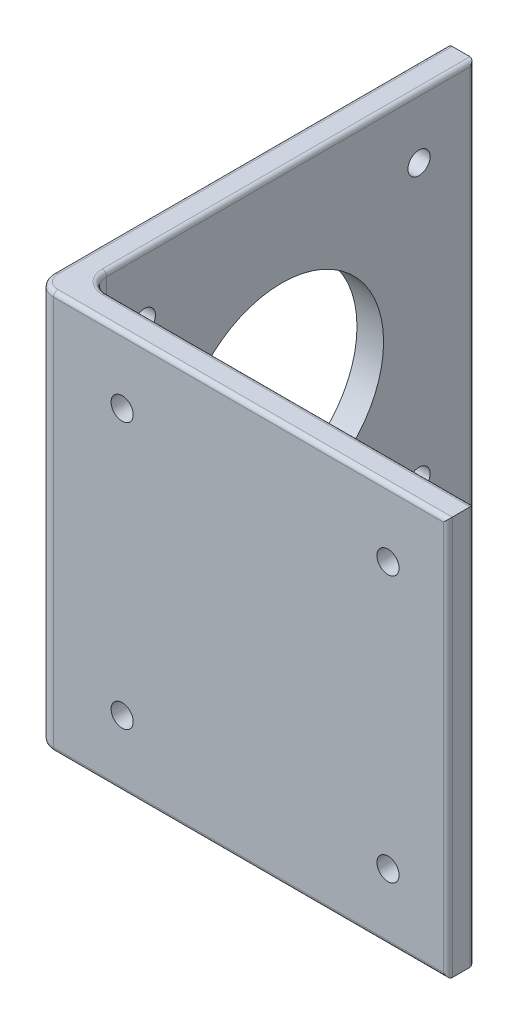
ISO-10303-21;
HEADER;
FILE_DESCRIPTION(('STEP AP214'),'2;1');
FILE_NAME('part.step','',(''),(''),'','','');
FILE_SCHEMA(('AUTOMOTIVE_DESIGN { 1 0 10303 214 1 1 1 1 }'));
ENDSEC;
DATA;
#1=APPLICATION_CONTEXT('core data for automotive mechanical design processes');
#2=APPLICATION_PROTOCOL_DEFINITION('international standard','automotive_design',2000,#1);
#3=PRODUCT_CONTEXT('',#1,'mechanical');
#4=PRODUCT('Part','Part','',(#3));
#5=PRODUCT_RELATED_PRODUCT_CATEGORY('part','',(#4));
#6=PRODUCT_DEFINITION_FORMATION('','',#4);
#7=PRODUCT_DEFINITION_CONTEXT('part definition',#1,'design');
#8=PRODUCT_DEFINITION('design','',#6,#7);
#9=PRODUCT_DEFINITION_SHAPE('','',#8);
#10=(LENGTH_UNIT() NAMED_UNIT(*) SI_UNIT(.MILLI.,.METRE.));
#11=(NAMED_UNIT(*) PLANE_ANGLE_UNIT() SI_UNIT($,.RADIAN.));
#12=(NAMED_UNIT(*) SI_UNIT($,.STERADIAN.) SOLID_ANGLE_UNIT());
#13=UNCERTAINTY_MEASURE_WITH_UNIT(LENGTH_MEASURE(1.E-05),#10,'distance_accuracy_value','');
#14=(GEOMETRIC_REPRESENTATION_CONTEXT(3) GLOBAL_UNCERTAINTY_ASSIGNED_CONTEXT((#13)) GLOBAL_UNIT_ASSIGNED_CONTEXT((#10,
#11,#12)) REPRESENTATION_CONTEXT('',''));
#15=CARTESIAN_POINT('',(0.,0.,0.));
#16=DIRECTION('',(0.,0.,1.));
#17=DIRECTION('',(1.,0.,0.));
#18=AXIS2_PLACEMENT_3D('',#15,#16,#17);
#19=CARTESIAN_POINT('',(-22.5,45.,24.));
#20=DIRECTION('',(0.,0.,-1.));
#21=DIRECTION('',(-1.,0.,0.));
#22=AXIS2_PLACEMENT_3D('',#19,#20,#21);
#23=PLANE('',#22);
#24=DIRECTION('',(0.,-1.,0.));
#25=VECTOR('',#24,1.);
#26=CARTESIAN_POINT('',(-22.,45.,24.));
#27=LINE('',#26,#25);
#28=CARTESIAN_POINT('',(-22.,44.5,24.));
#29=VERTEX_POINT('',#28);
#30=CARTESIAN_POINT('',(-22.,0.5,24.));
#31=VERTEX_POINT('',#30);
#32=EDGE_CURVE('E300',#29,#31,#27,.T.);
#33=ORIENTED_EDGE('',*,*,#32,.T.);
#34=DIRECTION('',(1.,0.,0.));
#35=VECTOR('',#34,1.);
#36=CARTESIAN_POINT('',(22.5,0.5,24.));
#37=LINE('',#36,#35);
#38=CARTESIAN_POINT('',(22.,0.5,24.));
#39=VERTEX_POINT('',#38);
#40=EDGE_CURVE('E255',#31,#39,#37,.T.);
#41=ORIENTED_EDGE('',*,*,#40,.T.);
#42=DIRECTION('',(0.,-1.,0.));
#43=VECTOR('',#42,1.);
#44=CARTESIAN_POINT('',(22.,45.,24.));
#45=LINE('',#44,#43);
#46=CARTESIAN_POINT('',(22.,44.5,24.));
#47=VERTEX_POINT('',#46);
#48=EDGE_CURVE('E259',#39,#47,#45,.F.);
#49=ORIENTED_EDGE('',*,*,#48,.T.);
#50=DIRECTION('',(1.,0.,0.));
#51=VECTOR('',#50,1.);
#52=CARTESIAN_POINT('',(-22.5,44.5,24.));
#53=LINE('',#52,#51);
#54=EDGE_CURVE('E257',#47,#29,#53,.F.);
#55=ORIENTED_EDGE('',*,*,#54,.T.);
#56=EDGE_LOOP('',(#33,#41,#49,#55));
#57=FACE_BOUND('',#56,.T.);
#58=CARTESIAN_POINT('',(-14.25,37.5,24.));
#59=DIRECTION('',(0.,0.,-1.));
#60=DIRECTION('',(-1.,0.,0.));
#61=AXIS2_PLACEMENT_3D('',#58,#59,#60);
#62=CIRCLE('',#61,1.24999999999999);
#63=CARTESIAN_POINT('',(-15.5,37.5,24.));
#64=VERTEX_POINT('',#63);
#65=EDGE_CURVE('E350',#64,#64,#62,.T.);
#66=ORIENTED_EDGE('',*,*,#65,.T.);
#67=EDGE_LOOP('',(#66));
#68=FACE_BOUND('',#67,.T.);
#69=CARTESIAN_POINT('',(-14.25,7.5,24.));
#70=DIRECTION('',(0.,0.,-1.));
#71=DIRECTION('',(-1.,0.,0.));
#72=AXIS2_PLACEMENT_3D('',#69,#70,#71);
#73=CIRCLE('',#72,1.24999999999999);
#74=CARTESIAN_POINT('',(-15.5,7.5,24.));
#75=VERTEX_POINT('',#74);
#76=EDGE_CURVE('E344',#75,#75,#73,.T.);
#77=ORIENTED_EDGE('',*,*,#76,.T.);
#78=EDGE_LOOP('',(#77));
#79=FACE_BOUND('',#78,.T.);
#80=CARTESIAN_POINT('',(15.75,7.5,24.));
#81=DIRECTION('',(0.,0.,-1.));
#82=DIRECTION('',(-1.,0.,0.));
#83=AXIS2_PLACEMENT_3D('',#80,#81,#82);
#84=CIRCLE('',#83,1.24999999999999);
#85=CARTESIAN_POINT('',(14.5,7.5,24.));
#86=VERTEX_POINT('',#85);
#87=EDGE_CURVE('E338',#86,#86,#84,.T.);
#88=ORIENTED_EDGE('',*,*,#87,.T.);
#89=EDGE_LOOP('',(#88));
#90=FACE_BOUND('',#89,.T.);
#91=CARTESIAN_POINT('',(15.75,37.5,24.));
#92=DIRECTION('',(0.,0.,-1.));
#93=DIRECTION('',(-1.,0.,0.));
#94=AXIS2_PLACEMENT_3D('',#91,#92,#93);
#95=CIRCLE('',#94,1.24999999999999);
#96=CARTESIAN_POINT('',(14.5,37.5,24.));
#97=VERTEX_POINT('',#96);
#98=EDGE_CURVE('E332',#97,#97,#95,.T.);
#99=ORIENTED_EDGE('',*,*,#98,.T.);
#100=EDGE_LOOP('',(#99));
#101=FACE_BOUND('',#100,.T.);
#102=ADVANCED_FACE('F39',(#57,#68,#79,#90,#101),#23,.F.);
#103=CARTESIAN_POINT('',(22.5,45.,21.));
#104=DIRECTION('',(1.,0.,0.));
#105=DIRECTION('',(0.,0.,-1.));
#106=AXIS2_PLACEMENT_3D('',#103,#104,#105);
#107=PLANE('',#106);
#108=DIRECTION('',(0.,0.,1.));
#109=VECTOR('',#108,1.);
#110=CARTESIAN_POINT('',(22.5,0.,21.));
#111=LINE('',#110,#109);
#112=CARTESIAN_POINT('',(22.5,0.,21.5));
#113=VERTEX_POINT('',#112);
#114=CARTESIAN_POINT('',(22.5,0.,23.5));
#115=VERTEX_POINT('',#114);
#116=EDGE_CURVE('E176',#113,#115,#111,.T.);
#117=ORIENTED_EDGE('',*,*,#116,.F.);
#118=DIRECTION('',(0.,-1.,0.));
#119=VECTOR('',#118,1.);
#120=CARTESIAN_POINT('',(22.5,45.,21.5));
#121=LINE('',#120,#119);
#122=CARTESIAN_POINT('',(22.5,45.,21.5));
#123=VERTEX_POINT('',#122);
#124=EDGE_CURVE('E11',#113,#123,#121,.F.);
#125=ORIENTED_EDGE('',*,*,#124,.T.);
#126=DIRECTION('',(0.,0.,1.));
#127=VECTOR('',#126,1.);
#128=CARTESIAN_POINT('',(22.5,45.,21.));
#129=LINE('',#128,#127);
#130=CARTESIAN_POINT('',(22.5,45.,23.5));
#131=VERTEX_POINT('',#130);
#132=EDGE_CURVE('E175',#123,#131,#129,.T.);
#133=ORIENTED_EDGE('',*,*,#132,.T.);
#134=DIRECTION('',(0.,-1.,0.));
#135=VECTOR('',#134,1.);
#136=CARTESIAN_POINT('',(22.5,0.,23.5));
#137=LINE('',#136,#135);
#138=EDGE_CURVE('E48',#131,#115,#137,.T.);
#139=ORIENTED_EDGE('',*,*,#138,.T.);
#140=EDGE_LOOP('',(#117,#125,#133,#139));
#141=FACE_BOUND('',#140,.T.);
#142=ADVANCED_FACE('F394',(#141),#107,.T.);
#143=CARTESIAN_POINT('',(-22.5,45.,21.));
#144=DIRECTION('',(0.,0.,-1.));
#145=DIRECTION('',(-1.,0.,0.));
#146=AXIS2_PLACEMENT_3D('',#143,#144,#145);
#147=PLANE('',#146);
#148=CARTESIAN_POINT('',(-14.25,37.5,21.));
#149=DIRECTION('',(0.,0.,-1.));
#150=DIRECTION('',(-1.,0.,0.));
#151=AXIS2_PLACEMENT_3D('',#148,#149,#150);
#152=CIRCLE('',#151,1.24999999999999);
#153=CARTESIAN_POINT('',(-15.5,37.5,21.));
#154=VERTEX_POINT('',#153);
#155=EDGE_CURVE('E209',#154,#154,#152,.T.);
#156=ORIENTED_EDGE('',*,*,#155,.F.);
#157=EDGE_LOOP('',(#156));
#158=FACE_BOUND('',#157,.T.);
#159=CARTESIAN_POINT('',(-14.25,7.5,21.));
#160=DIRECTION('',(0.,0.,-1.));
#161=DIRECTION('',(-1.,0.,0.));
#162=AXIS2_PLACEMENT_3D('',#159,#160,#161);
#163=CIRCLE('',#162,1.24999999999999);
#164=CARTESIAN_POINT('',(-15.5,7.5,21.));
#165=VERTEX_POINT('',#164);
#166=EDGE_CURVE('E347',#165,#165,#163,.T.);
#167=ORIENTED_EDGE('',*,*,#166,.F.);
#168=EDGE_LOOP('',(#167));
#169=FACE_BOUND('',#168,.T.);
#170=CARTESIAN_POINT('',(15.75,7.5,21.));
#171=DIRECTION('',(0.,0.,-1.));
#172=DIRECTION('',(-1.,0.,0.));
#173=AXIS2_PLACEMENT_3D('',#170,#171,#172);
#174=CIRCLE('',#173,1.24999999999999);
#175=CARTESIAN_POINT('',(14.5,7.5,21.));
#176=VERTEX_POINT('',#175);
#177=EDGE_CURVE('E341',#176,#176,#174,.T.);
#178=ORIENTED_EDGE('',*,*,#177,.F.);
#179=EDGE_LOOP('',(#178));
#180=FACE_BOUND('',#179,.T.);
#181=CARTESIAN_POINT('',(15.75,37.5,21.));
#182=DIRECTION('',(0.,0.,-1.));
#183=DIRECTION('',(-1.,0.,0.));
#184=AXIS2_PLACEMENT_3D('',#181,#182,#183);
#185=CIRCLE('',#184,1.24999999999999);
#186=CARTESIAN_POINT('',(14.5,37.5,21.));
#187=VERTEX_POINT('',#186);
#188=EDGE_CURVE('E335',#187,#187,#185,.T.);
#189=ORIENTED_EDGE('',*,*,#188,.F.);
#190=EDGE_LOOP('',(#189));
#191=FACE_BOUND('',#190,.T.);
#192=DIRECTION('',(0.,-1.,0.));
#193=VECTOR('',#192,1.);
#194=CARTESIAN_POINT('',(22.,45.,21.));
#195=LINE('',#194,#193);
#196=CARTESIAN_POINT('',(22.,44.5,21.));
#197=VERTEX_POINT('',#196);
#198=CARTESIAN_POINT('',(22.,0.5,21.));
#199=VERTEX_POINT('',#198);
#200=EDGE_CURVE('E253',#197,#199,#195,.T.);
#201=ORIENTED_EDGE('',*,*,#200,.T.);
#202=DIRECTION('',(1.,0.,0.));
#203=VECTOR('',#202,1.);
#204=CARTESIAN_POINT('',(-22.5,0.5,21.));
#205=LINE('',#204,#203);
#206=CARTESIAN_POINT('',(-19.,0.5,21.));
#207=VERTEX_POINT('',#206);
#208=EDGE_CURVE('E249',#199,#207,#205,.F.);
#209=ORIENTED_EDGE('',*,*,#208,.T.);
#210=DIRECTION('',(0.,-1.,0.));
#211=VECTOR('',#210,1.);
#212=CARTESIAN_POINT('',(-19.,45.,21.));
#213=LINE('',#212,#211);
#214=CARTESIAN_POINT('',(-19.,44.5,21.));
#215=VERTEX_POINT('',#214);
#216=EDGE_CURVE('E292',#207,#215,#213,.F.);
#217=ORIENTED_EDGE('',*,*,#216,.T.);
#218=DIRECTION('',(1.,0.,0.));
#219=VECTOR('',#218,1.);
#220=CARTESIAN_POINT('',(22.5,44.5,21.));
#221=LINE('',#220,#219);
#222=EDGE_CURVE('E251',#215,#197,#221,.T.);
#223=ORIENTED_EDGE('',*,*,#222,.T.);
#224=EDGE_LOOP('',(#201,#209,#217,#223));
#225=FACE_BOUND('',#224,.T.);
#226=ADVANCED_FACE('F367',(#158,#169,#180,#191,#225),#147,.T.);
#227=CARTESIAN_POINT('',(-21.,45.,-22.5));
#228=DIRECTION('',(1.,0.,0.));
#229=DIRECTION('',(0.,0.,-1.));
#230=AXIS2_PLACEMENT_3D('',#227,#228,#229);
#231=PLANE('',#230);
#232=CARTESIAN_POINT('',(-21.,22.5,-0.75));
#233=DIRECTION('',(1.,0.,0.));
#234=DIRECTION('',(0.,0.,-1.));
#235=AXIS2_PLACEMENT_3D('',#232,#233,#234);
#236=CIRCLE('',#235,11.5);
#237=CARTESIAN_POINT('',(-21.,22.5,-12.25));
#238=VERTEX_POINT('',#237);
#239=EDGE_CURVE('E357',#238,#238,#236,.T.);
#240=ORIENTED_EDGE('',*,*,#239,.F.);
#241=EDGE_LOOP('',(#240));
#242=FACE_BOUND('',#241,.T.);
#243=CARTESIAN_POINT('',(-21.,38.,14.75));
#244=DIRECTION('',(1.,0.,0.));
#245=DIRECTION('',(0.,0.,-1.));
#246=AXIS2_PLACEMENT_3D('',#243,#244,#245);
#247=CIRCLE('',#246,1.24999999999999);
#248=CARTESIAN_POINT('',(-21.,38.,13.5));
#249=VERTEX_POINT('',#248);
#250=EDGE_CURVE('E329',#249,#249,#247,.T.);
#251=ORIENTED_EDGE('',*,*,#250,.F.);
#252=EDGE_LOOP('',(#251));
#253=FACE_BOUND('',#252,.T.);
#254=CARTESIAN_POINT('',(-21.,38.,-16.25));
#255=DIRECTION('',(1.,0.,0.));
#256=DIRECTION('',(0.,0.,-1.));
#257=AXIS2_PLACEMENT_3D('',#254,#255,#256);
#258=CIRCLE('',#257,1.24999999999999);
#259=CARTESIAN_POINT('',(-21.,38.,-17.5));
#260=VERTEX_POINT('',#259);
#261=EDGE_CURVE('E323',#260,#260,#258,.T.);
#262=ORIENTED_EDGE('',*,*,#261,.F.);
#263=EDGE_LOOP('',(#262));
#264=FACE_BOUND('',#263,.T.);
#265=CARTESIAN_POINT('',(-21.,7.,-16.25));
#266=DIRECTION('',(1.,0.,0.));
#267=DIRECTION('',(0.,0.,-1.));
#268=AXIS2_PLACEMENT_3D('',#265,#266,#267);
#269=CIRCLE('',#268,1.24999999999999);
#270=CARTESIAN_POINT('',(-21.,7.,-17.5));
#271=VERTEX_POINT('',#270);
#272=EDGE_CURVE('E317',#271,#271,#269,.T.);
#273=ORIENTED_EDGE('',*,*,#272,.F.);
#274=EDGE_LOOP('',(#273));
#275=FACE_BOUND('',#274,.T.);
#276=CARTESIAN_POINT('',(-21.,7.,14.75));
#277=DIRECTION('',(1.,0.,0.));
#278=DIRECTION('',(0.,0.,-1.));
#279=AXIS2_PLACEMENT_3D('',#276,#277,#278);
#280=CIRCLE('',#279,1.24999999999999);
#281=CARTESIAN_POINT('',(-21.,7.,13.5));
#282=VERTEX_POINT('',#281);
#283=EDGE_CURVE('E311',#282,#282,#280,.T.);
#284=ORIENTED_EDGE('',*,*,#283,.F.);
#285=EDGE_LOOP('',(#284));
#286=FACE_BOUND('',#285,.T.);
#287=DIRECTION('',(0.,-1.,0.));
#288=VECTOR('',#287,1.);
#289=CARTESIAN_POINT('',(-21.,45.,-22.));
#290=LINE('',#289,#288);
#291=CARTESIAN_POINT('',(-21.,0.5,-22.));
#292=VERTEX_POINT('',#291);
#293=CARTESIAN_POINT('',(-21.,44.5,-22.));
#294=VERTEX_POINT('',#293);
#295=EDGE_CURVE('E56',#292,#294,#290,.F.);
#296=ORIENTED_EDGE('',*,*,#295,.T.);
#297=DIRECTION('',(0.,0.,1.));
#298=VECTOR('',#297,1.);
#299=CARTESIAN_POINT('',(-21.,44.5,19.));
#300=LINE('',#299,#298);
#301=CARTESIAN_POINT('',(-21.,44.5,19.));
#302=VERTEX_POINT('',#301);
#303=EDGE_CURVE('E240',#294,#302,#300,.T.);
#304=ORIENTED_EDGE('',*,*,#303,.T.);
#305=DIRECTION('',(0.,-1.,0.));
#306=VECTOR('',#305,1.);
#307=CARTESIAN_POINT('',(-21.,0.,19.));
#308=LINE('',#307,#306);
#309=CARTESIAN_POINT('',(-21.,0.5,19.));
#310=VERTEX_POINT('',#309);
#311=EDGE_CURVE('E295',#302,#310,#308,.T.);
#312=ORIENTED_EDGE('',*,*,#311,.T.);
#313=DIRECTION('',(0.,0.,1.));
#314=VECTOR('',#313,1.);
#315=CARTESIAN_POINT('',(-21.,0.5,-22.5));
#316=LINE('',#315,#314);
#317=EDGE_CURVE('E61',#310,#292,#316,.F.);
#318=ORIENTED_EDGE('',*,*,#317,.T.);
#319=EDGE_LOOP('',(#296,#304,#312,#318));
#320=FACE_BOUND('',#319,.T.);
#321=ADVANCED_FACE('F364',(#242,#253,#264,#275,#286,#320),#231,.T.);
#322=CARTESIAN_POINT('',(-24.,45.,-22.5));
#323=DIRECTION('',(0.,0.,-1.));
#324=DIRECTION('',(-1.,0.,0.));
#325=AXIS2_PLACEMENT_3D('',#322,#323,#324);
#326=PLANE('',#325);
#327=DIRECTION('',(1.,0.,0.));
#328=VECTOR('',#327,1.);
#329=CARTESIAN_POINT('',(-24.,0.,-22.5));
#330=LINE('',#329,#328);
#331=CARTESIAN_POINT('',(-23.5,0.,-22.5));
#332=VERTEX_POINT('',#331);
#333=CARTESIAN_POINT('',(-21.5,0.,-22.5));
#334=VERTEX_POINT('',#333);
#335=EDGE_CURVE('E158',#332,#334,#330,.T.);
#336=ORIENTED_EDGE('',*,*,#335,.F.);
#337=DIRECTION('',(0.,-1.,0.));
#338=VECTOR('',#337,1.);
#339=CARTESIAN_POINT('',(-23.5,45.,-22.5));
#340=LINE('',#339,#338);
#341=CARTESIAN_POINT('',(-23.5,45.,-22.5));
#342=VERTEX_POINT('',#341);
#343=EDGE_CURVE('E171',#332,#342,#340,.F.);
#344=ORIENTED_EDGE('',*,*,#343,.T.);
#345=DIRECTION('',(1.,0.,0.));
#346=VECTOR('',#345,1.);
#347=CARTESIAN_POINT('',(-24.,45.,-22.5));
#348=LINE('',#347,#346);
#349=CARTESIAN_POINT('',(-21.5,45.,-22.5));
#350=VERTEX_POINT('',#349);
#351=EDGE_CURVE('E302',#342,#350,#348,.T.);
#352=ORIENTED_EDGE('',*,*,#351,.T.);
#353=DIRECTION('',(0.,-1.,0.));
#354=VECTOR('',#353,1.);
#355=CARTESIAN_POINT('',(-21.5,45.,-22.5));
#356=LINE('',#355,#354);
#357=EDGE_CURVE('E174',#350,#334,#356,.T.);
#358=ORIENTED_EDGE('',*,*,#357,.T.);
#359=EDGE_LOOP('',(#336,#344,#352,#358));
#360=FACE_BOUND('',#359,.T.);
#361=ADVANCED_FACE('F169',(#360),#326,.T.);
#362=CARTESIAN_POINT('',(-24.,45.,-22.5));
#363=DIRECTION('',(1.,0.,0.));
#364=DIRECTION('',(0.,0.,-1.));
#365=AXIS2_PLACEMENT_3D('',#362,#363,#364);
#366=PLANE('',#365);
#367=CARTESIAN_POINT('',(-24.,22.5,-0.75));
#368=DIRECTION('',(1.,0.,0.));
#369=DIRECTION('',(0.,0.,-1.));
#370=AXIS2_PLACEMENT_3D('',#367,#368,#369);
#371=CIRCLE('',#370,11.5);
#372=CARTESIAN_POINT('',(-24.,22.5,-12.25));
#373=VERTEX_POINT('',#372);
#374=EDGE_CURVE('E213',#373,#373,#371,.F.);
#375=ORIENTED_EDGE('',*,*,#374,.F.);
#376=EDGE_LOOP('',(#375));
#377=FACE_BOUND('',#376,.T.);
#378=CARTESIAN_POINT('',(-24.,38.,14.75));
#379=DIRECTION('',(1.,0.,0.));
#380=DIRECTION('',(0.,0.,-1.));
#381=AXIS2_PLACEMENT_3D('',#378,#379,#380);
#382=CIRCLE('',#381,1.24999999999999);
#383=CARTESIAN_POINT('',(-24.,38.,13.5));
#384=VERTEX_POINT('',#383);
#385=EDGE_CURVE('E326',#384,#384,#382,.T.);
#386=ORIENTED_EDGE('',*,*,#385,.T.);
#387=EDGE_LOOP('',(#386));
#388=FACE_BOUND('',#387,.T.);
#389=CARTESIAN_POINT('',(-24.,38.,-16.25));
#390=DIRECTION('',(1.,0.,0.));
#391=DIRECTION('',(0.,0.,-1.));
#392=AXIS2_PLACEMENT_3D('',#389,#390,#391);
#393=CIRCLE('',#392,1.24999999999999);
#394=CARTESIAN_POINT('',(-24.,38.,-17.5));
#395=VERTEX_POINT('',#394);
#396=EDGE_CURVE('E320',#395,#395,#393,.T.);
#397=ORIENTED_EDGE('',*,*,#396,.T.);
#398=EDGE_LOOP('',(#397));
#399=FACE_BOUND('',#398,.T.);
#400=CARTESIAN_POINT('',(-24.,7.,-16.25));
#401=DIRECTION('',(1.,0.,0.));
#402=DIRECTION('',(0.,0.,-1.));
#403=AXIS2_PLACEMENT_3D('',#400,#401,#402);
#404=CIRCLE('',#403,1.24999999999999);
#405=CARTESIAN_POINT('',(-24.,7.,-17.5));
#406=VERTEX_POINT('',#405);
#407=EDGE_CURVE('E314',#406,#406,#404,.T.);
#408=ORIENTED_EDGE('',*,*,#407,.T.);
#409=EDGE_LOOP('',(#408));
#410=FACE_BOUND('',#409,.T.);
#411=CARTESIAN_POINT('',(-24.,7.,14.75));
#412=DIRECTION('',(1.,0.,0.));
#413=DIRECTION('',(0.,0.,-1.));
#414=AXIS2_PLACEMENT_3D('',#411,#412,#413);
#415=CIRCLE('',#414,1.24999999999999);
#416=CARTESIAN_POINT('',(-24.,7.,13.5));
#417=VERTEX_POINT('',#416);
#418=EDGE_CURVE('E305',#417,#417,#415,.T.);
#419=ORIENTED_EDGE('',*,*,#418,.T.);
#420=EDGE_LOOP('',(#419));
#421=FACE_BOUND('',#420,.T.);
#422=DIRECTION('',(0.,-1.,0.));
#423=VECTOR('',#422,1.);
#424=CARTESIAN_POINT('',(-24.,0.,-22.));
#425=LINE('',#424,#423);
#426=CARTESIAN_POINT('',(-24.,44.5,-22.));
#427=VERTEX_POINT('',#426);
#428=CARTESIAN_POINT('',(-24.,0.5,-22.));
#429=VERTEX_POINT('',#428);
#430=EDGE_CURVE('E247',#427,#429,#425,.T.);
#431=ORIENTED_EDGE('',*,*,#430,.T.);
#432=DIRECTION('',(0.,0.,1.));
#433=VECTOR('',#432,1.);
#434=CARTESIAN_POINT('',(-24.,0.5,22.));
#435=LINE('',#434,#433);
#436=CARTESIAN_POINT('',(-24.,0.5,22.));
#437=VERTEX_POINT('',#436);
#438=EDGE_CURVE('E189',#429,#437,#435,.T.);
#439=ORIENTED_EDGE('',*,*,#438,.T.);
#440=DIRECTION('',(0.,-1.,0.));
#441=VECTOR('',#440,1.);
#442=CARTESIAN_POINT('',(-24.,45.,22.));
#443=LINE('',#442,#441);
#444=CARTESIAN_POINT('',(-24.,44.5,22.));
#445=VERTEX_POINT('',#444);
#446=EDGE_CURVE('E297',#437,#445,#443,.F.);
#447=ORIENTED_EDGE('',*,*,#446,.T.);
#448=DIRECTION('',(0.,0.,1.));
#449=VECTOR('',#448,1.);
#450=CARTESIAN_POINT('',(-24.,44.5,-22.5));
#451=LINE('',#450,#449);
#452=EDGE_CURVE('E245',#445,#427,#451,.F.);
#453=ORIENTED_EDGE('',*,*,#452,.T.);
#454=EDGE_LOOP('',(#431,#439,#447,#453));
#455=FACE_BOUND('',#454,.T.);
#456=ADVANCED_FACE('F509',(#377,#388,#399,#410,#421,#455),#366,.F.);
#457=CARTESIAN_POINT('',(0.,45.,0.));
#458=DIRECTION('',(0.,-1.,0.));
#459=DIRECTION('',(-1.,0.,0.));
#460=AXIS2_PLACEMENT_3D('',#457,#458,#459);
#461=PLANE('',#460);
#462=ORIENTED_EDGE('',*,*,#132,.F.);
#463=DIRECTION('',(1.,0.,0.));
#464=VECTOR('',#463,1.);
#465=CARTESIAN_POINT('',(-19.,45.,21.5));
#466=LINE('',#465,#464);
#467=CARTESIAN_POINT('',(-19.,45.,21.5));
#468=VERTEX_POINT('',#467);
#469=EDGE_CURVE('E266',#123,#468,#466,.F.);
#470=ORIENTED_EDGE('',*,*,#469,.T.);
#471=CARTESIAN_POINT('',(-19.,45.,19.));
#472=DIRECTION('',(0.,-1.,0.));
#473=DIRECTION('',(0.,0.,-1.));
#474=AXIS2_PLACEMENT_3D('',#471,#472,#473);
#475=CIRCLE('',#474,2.5);
#476=CARTESIAN_POINT('',(-21.5,45.,19.));
#477=VERTEX_POINT('',#476);
#478=EDGE_CURVE('E268',#468,#477,#475,.T.);
#479=ORIENTED_EDGE('',*,*,#478,.T.);
#480=DIRECTION('',(0.,0.,1.));
#481=VECTOR('',#480,1.);
#482=CARTESIAN_POINT('',(-21.5,45.,-22.5));
#483=LINE('',#482,#481);
#484=EDGE_CURVE('E271',#477,#350,#483,.F.);
#485=ORIENTED_EDGE('',*,*,#484,.T.);
#486=ORIENTED_EDGE('',*,*,#351,.F.);
#487=DIRECTION('',(0.,0.,1.));
#488=VECTOR('',#487,1.);
#489=CARTESIAN_POINT('',(-23.5,45.,0.));
#490=LINE('',#489,#488);
#491=CARTESIAN_POINT('',(-23.5,45.,22.));
#492=VERTEX_POINT('',#491);
#493=EDGE_CURVE('E277',#342,#492,#490,.T.);
#494=ORIENTED_EDGE('',*,*,#493,.T.);
#495=CARTESIAN_POINT('',(-22.,45.,22.));
#496=DIRECTION('',(0.,-1.,0.));
#497=DIRECTION('',(0.,0.,-1.));
#498=AXIS2_PLACEMENT_3D('',#495,#496,#497);
#499=CIRCLE('',#498,1.5);
#500=CARTESIAN_POINT('',(-22.,45.,23.5));
#501=VERTEX_POINT('',#500);
#502=EDGE_CURVE('E275',#492,#501,#499,.F.);
#503=ORIENTED_EDGE('',*,*,#502,.T.);
#504=DIRECTION('',(1.,0.,0.));
#505=VECTOR('',#504,1.);
#506=CARTESIAN_POINT('',(0.,45.,23.5));
#507=LINE('',#506,#505);
#508=EDGE_CURVE('E273',#501,#131,#507,.T.);
#509=ORIENTED_EDGE('',*,*,#508,.T.);
#510=EDGE_LOOP('',(#462,#470,#479,#485,#486,#494,#503,#509));
#511=FACE_BOUND('',#510,.T.);
#512=ADVANCED_FACE('F389',(#511),#461,.F.);
#513=CARTESIAN_POINT('',(0.,0.,0.));
#514=DIRECTION('',(0.,-1.,0.));
#515=DIRECTION('',(-1.,0.,0.));
#516=AXIS2_PLACEMENT_3D('',#513,#514,#515);
#517=PLANE('',#516);
#518=ORIENTED_EDGE('',*,*,#116,.T.);
#519=DIRECTION('',(1.,0.,0.));
#520=VECTOR('',#519,1.);
#521=CARTESIAN_POINT('',(-22.,0.,23.5));
#522=LINE('',#521,#520);
#523=CARTESIAN_POINT('',(-22.,0.,23.5));
#524=VERTEX_POINT('',#523);
#525=EDGE_CURVE('E284',#115,#524,#522,.F.);
#526=ORIENTED_EDGE('',*,*,#525,.T.);
#527=CARTESIAN_POINT('',(-22.,0.,22.));
#528=DIRECTION('',(0.,-1.,0.));
#529=DIRECTION('',(0.,0.,-1.));
#530=AXIS2_PLACEMENT_3D('',#527,#528,#529);
#531=CIRCLE('',#530,1.5);
#532=CARTESIAN_POINT('',(-23.5,0.,22.));
#533=VERTEX_POINT('',#532);
#534=EDGE_CURVE('E161',#524,#533,#531,.T.);
#535=ORIENTED_EDGE('',*,*,#534,.T.);
#536=DIRECTION('',(0.,0.,1.));
#537=VECTOR('',#536,1.);
#538=CARTESIAN_POINT('',(-23.5,0.,-22.5));
#539=LINE('',#538,#537);
#540=EDGE_CURVE('E154',#533,#332,#539,.F.);
#541=ORIENTED_EDGE('',*,*,#540,.T.);
#542=ORIENTED_EDGE('',*,*,#335,.T.);
#543=DIRECTION('',(0.,0.,1.));
#544=VECTOR('',#543,1.);
#545=CARTESIAN_POINT('',(-21.5,0.,0.));
#546=LINE('',#545,#544);
#547=CARTESIAN_POINT('',(-21.5,0.,19.));
#548=VERTEX_POINT('',#547);
#549=EDGE_CURVE('E290',#334,#548,#546,.T.);
#550=ORIENTED_EDGE('',*,*,#549,.T.);
#551=CARTESIAN_POINT('',(-19.,0.,19.));
#552=DIRECTION('',(0.,-1.,0.));
#553=DIRECTION('',(0.,0.,-1.));
#554=AXIS2_PLACEMENT_3D('',#551,#552,#553);
#555=CIRCLE('',#554,2.5);
#556=CARTESIAN_POINT('',(-19.,0.,21.5));
#557=VERTEX_POINT('',#556);
#558=EDGE_CURVE('E288',#548,#557,#555,.F.);
#559=ORIENTED_EDGE('',*,*,#558,.T.);
#560=DIRECTION('',(1.,0.,0.));
#561=VECTOR('',#560,1.);
#562=CARTESIAN_POINT('',(0.,0.,21.5));
#563=LINE('',#562,#561);
#564=EDGE_CURVE('E165',#557,#113,#563,.T.);
#565=ORIENTED_EDGE('',*,*,#564,.T.);
#566=EDGE_LOOP('',(#518,#526,#535,#541,#542,#550,#559,#565));
#567=FACE_BOUND('',#566,.T.);
#568=ADVANCED_FACE('F157',(#567),#517,.T.);
#569=CARTESIAN_POINT('',(-21.,7.,14.75));
#570=DIRECTION('',(1.,0.,0.));
#571=DIRECTION('',(0.,0.,-1.));
#572=AXIS2_PLACEMENT_3D('',#569,#570,#571);
#573=CYLINDRICAL_SURFACE('',#572,1.24999999999999);
#574=ORIENTED_EDGE('',*,*,#418,.F.);
#575=EDGE_LOOP('',(#574));
#576=FACE_BOUND('',#575,.T.);
#577=ORIENTED_EDGE('',*,*,#283,.T.);
#578=EDGE_LOOP('',(#577));
#579=FACE_BOUND('',#578,.T.);
#580=ADVANCED_FACE('F377',(#576,#579),#573,.F.);
#581=CARTESIAN_POINT('',(-21.,7.,-16.25));
#582=DIRECTION('',(1.,0.,0.));
#583=DIRECTION('',(0.,0.,-1.));
#584=AXIS2_PLACEMENT_3D('',#581,#582,#583);
#585=CYLINDRICAL_SURFACE('',#584,1.24999999999999);
#586=ORIENTED_EDGE('',*,*,#407,.F.);
#587=EDGE_LOOP('',(#586));
#588=FACE_BOUND('',#587,.T.);
#589=ORIENTED_EDGE('',*,*,#272,.T.);
#590=EDGE_LOOP('',(#589));
#591=FACE_BOUND('',#590,.T.);
#592=ADVANCED_FACE('F379',(#588,#591),#585,.F.);
#593=CARTESIAN_POINT('',(-21.,38.,-16.25));
#594=DIRECTION('',(1.,0.,0.));
#595=DIRECTION('',(0.,0.,-1.));
#596=AXIS2_PLACEMENT_3D('',#593,#594,#595);
#597=CYLINDRICAL_SURFACE('',#596,1.24999999999999);
#598=ORIENTED_EDGE('',*,*,#396,.F.);
#599=EDGE_LOOP('',(#598));
#600=FACE_BOUND('',#599,.T.);
#601=ORIENTED_EDGE('',*,*,#261,.T.);
#602=EDGE_LOOP('',(#601));
#603=FACE_BOUND('',#602,.T.);
#604=ADVANCED_FACE('F386',(#600,#603),#597,.F.);
#605=CARTESIAN_POINT('',(-21.,38.,14.75));
#606=DIRECTION('',(1.,0.,0.));
#607=DIRECTION('',(0.,0.,-1.));
#608=AXIS2_PLACEMENT_3D('',#605,#606,#607);
#609=CYLINDRICAL_SURFACE('',#608,1.24999999999999);
#610=ORIENTED_EDGE('',*,*,#385,.F.);
#611=EDGE_LOOP('',(#610));
#612=FACE_BOUND('',#611,.T.);
#613=ORIENTED_EDGE('',*,*,#250,.T.);
#614=EDGE_LOOP('',(#613));
#615=FACE_BOUND('',#614,.T.);
#616=ADVANCED_FACE('F409',(#612,#615),#609,.F.);
#617=CARTESIAN_POINT('',(-22.,45.,22.));
#618=DIRECTION('',(0.,-1.,0.));
#619=DIRECTION('',(0.,0.,-1.));
#620=AXIS2_PLACEMENT_3D('',#617,#618,#619);
#621=CYLINDRICAL_SURFACE('',#620,2.);
#622=ORIENTED_EDGE('',*,*,#446,.F.);
#623=CARTESIAN_POINT('',(-22.,0.5,22.));
#624=DIRECTION('',(0.,-1.,0.));
#625=DIRECTION('',(0.,0.,-1.));
#626=AXIS2_PLACEMENT_3D('',#623,#624,#625);
#627=CIRCLE('',#626,2.);
#628=EDGE_CURVE('E279',#437,#31,#627,.F.);
#629=ORIENTED_EDGE('',*,*,#628,.T.);
#630=ORIENTED_EDGE('',*,*,#32,.F.);
#631=CARTESIAN_POINT('',(-22.,44.5,22.));
#632=DIRECTION('',(0.,-1.,0.));
#633=DIRECTION('',(0.,0.,-1.));
#634=AXIS2_PLACEMENT_3D('',#631,#632,#633);
#635=CIRCLE('',#634,2.);
#636=EDGE_CURVE('E282',#29,#445,#635,.T.);
#637=ORIENTED_EDGE('',*,*,#636,.T.);
#638=EDGE_LOOP('',(#622,#629,#630,#637));
#639=FACE_BOUND('',#638,.T.);
#640=ADVANCED_FACE('F405',(#639),#621,.T.);
#641=CARTESIAN_POINT('',(-19.,45.,19.));
#642=DIRECTION('',(0.,1.,0.));
#643=DIRECTION('',(0.,0.,1.));
#644=AXIS2_PLACEMENT_3D('',#641,#642,#643);
#645=CYLINDRICAL_SURFACE('',#644,2.);
#646=ORIENTED_EDGE('',*,*,#311,.F.);
#647=CARTESIAN_POINT('',(-19.,44.5,19.));
#648=DIRECTION('',(0.,-1.,0.));
#649=DIRECTION('',(0.,0.,-1.));
#650=AXIS2_PLACEMENT_3D('',#647,#648,#649);
#651=CIRCLE('',#650,2.);
#652=EDGE_CURVE('E261',#302,#215,#651,.F.);
#653=ORIENTED_EDGE('',*,*,#652,.T.);
#654=ORIENTED_EDGE('',*,*,#216,.F.);
#655=CARTESIAN_POINT('',(-19.,0.5,19.));
#656=DIRECTION('',(0.,-1.,0.));
#657=DIRECTION('',(0.,0.,-1.));
#658=AXIS2_PLACEMENT_3D('',#655,#656,#657);
#659=CIRCLE('',#658,2.);
#660=EDGE_CURVE('E264',#207,#310,#659,.T.);
#661=ORIENTED_EDGE('',*,*,#660,.T.);
#662=EDGE_LOOP('',(#646,#653,#654,#661));
#663=FACE_BOUND('',#662,.T.);
#664=ADVANCED_FACE('F408',(#663),#645,.F.);
#665=CARTESIAN_POINT('',(15.75,37.5,21.));
#666=DIRECTION('',(0.,0.,-1.));
#667=DIRECTION('',(-1.,0.,0.));
#668=AXIS2_PLACEMENT_3D('',#665,#666,#667);
#669=CYLINDRICAL_SURFACE('',#668,1.24999999999999);
#670=ORIENTED_EDGE('',*,*,#98,.F.);
#671=EDGE_LOOP('',(#670));
#672=FACE_BOUND('',#671,.T.);
#673=ORIENTED_EDGE('',*,*,#188,.T.);
#674=EDGE_LOOP('',(#673));
#675=FACE_BOUND('',#674,.T.);
#676=ADVANCED_FACE('F413',(#672,#675),#669,.F.);
#677=CARTESIAN_POINT('',(15.75,7.5,21.));
#678=DIRECTION('',(0.,0.,-1.));
#679=DIRECTION('',(-1.,0.,0.));
#680=AXIS2_PLACEMENT_3D('',#677,#678,#679);
#681=CYLINDRICAL_SURFACE('',#680,1.24999999999999);
#682=ORIENTED_EDGE('',*,*,#87,.F.);
#683=EDGE_LOOP('',(#682));
#684=FACE_BOUND('',#683,.T.);
#685=ORIENTED_EDGE('',*,*,#177,.T.);
#686=EDGE_LOOP('',(#685));
#687=FACE_BOUND('',#686,.T.);
#688=ADVANCED_FACE('F533',(#684,#687),#681,.F.);
#689=CARTESIAN_POINT('',(-14.25,7.5,21.));
#690=DIRECTION('',(0.,0.,-1.));
#691=DIRECTION('',(-1.,0.,0.));
#692=AXIS2_PLACEMENT_3D('',#689,#690,#691);
#693=CYLINDRICAL_SURFACE('',#692,1.24999999999999);
#694=ORIENTED_EDGE('',*,*,#76,.F.);
#695=EDGE_LOOP('',(#694));
#696=FACE_BOUND('',#695,.T.);
#697=ORIENTED_EDGE('',*,*,#166,.T.);
#698=EDGE_LOOP('',(#697));
#699=FACE_BOUND('',#698,.T.);
#700=ADVANCED_FACE('F539',(#696,#699),#693,.F.);
#701=CARTESIAN_POINT('',(-14.25,37.5,21.));
#702=DIRECTION('',(0.,0.,-1.));
#703=DIRECTION('',(-1.,0.,0.));
#704=AXIS2_PLACEMENT_3D('',#701,#702,#703);
#705=CYLINDRICAL_SURFACE('',#704,1.24999999999999);
#706=ORIENTED_EDGE('',*,*,#65,.F.);
#707=EDGE_LOOP('',(#706));
#708=FACE_BOUND('',#707,.T.);
#709=ORIENTED_EDGE('',*,*,#155,.T.);
#710=EDGE_LOOP('',(#709));
#711=FACE_BOUND('',#710,.T.);
#712=ADVANCED_FACE('F441',(#708,#711),#705,.F.);
#713=CARTESIAN_POINT('',(-22.,44.5,22.));
#714=DIRECTION('',(0.,-1.,0.));
#715=DIRECTION('',(0.,0.,-1.));
#716=AXIS2_PLACEMENT_3D('',#713,#714,#715);
#717=TOROIDAL_SURFACE('',#716,1.5,0.5);
#718=CARTESIAN_POINT('',(-23.5,44.5,22.));
#719=DIRECTION('',(0.,0.,-1.));
#720=DIRECTION('',(-1.,0.,0.));
#721=AXIS2_PLACEMENT_3D('',#718,#719,#720);
#722=CIRCLE('',#721,0.5);
#723=EDGE_CURVE('E203',#445,#492,#722,.T.);
#724=ORIENTED_EDGE('',*,*,#723,.F.);
#725=ORIENTED_EDGE('',*,*,#636,.F.);
#726=CARTESIAN_POINT('',(-22.,44.5,23.5));
#727=DIRECTION('',(1.,0.,0.));
#728=DIRECTION('',(0.,0.,-1.));
#729=AXIS2_PLACEMENT_3D('',#726,#727,#728);
#730=CIRCLE('',#729,0.5);
#731=EDGE_CURVE('E206',#501,#29,#730,.T.);
#732=ORIENTED_EDGE('',*,*,#731,.F.);
#733=ORIENTED_EDGE('',*,*,#502,.F.);
#734=EDGE_LOOP('',(#724,#725,#732,#733));
#735=FACE_BOUND('',#734,.T.);
#736=ADVANCED_FACE('F437',(#735),#717,.T.);
#737=CARTESIAN_POINT('',(0.,44.5,23.5));
#738=DIRECTION('',(1.,0.,0.));
#739=DIRECTION('',(0.,0.,-1.));
#740=AXIS2_PLACEMENT_3D('',#737,#738,#739);
#741=CYLINDRICAL_SURFACE('',#740,0.5);
#742=ORIENTED_EDGE('',*,*,#731,.T.);
#743=ORIENTED_EDGE('',*,*,#54,.F.);
#744=CARTESIAN_POINT('',(22.,44.5,23.5));
#745=DIRECTION('',(-0.707106781186547,0.707106781186547,0.));
#746=DIRECTION('',(0.707106781186547,0.707106781186547,0.));
#747=AXIS2_PLACEMENT_3D('',#744,#745,#746);
#748=ELLIPSE('',#747,0.707106781186547,0.5);
#749=EDGE_CURVE('E200',#131,#47,#748,.F.);
#750=ORIENTED_EDGE('',*,*,#749,.F.);
#751=ORIENTED_EDGE('',*,*,#508,.F.);
#752=EDGE_LOOP('',(#742,#743,#750,#751));
#753=FACE_BOUND('',#752,.T.);
#754=ADVANCED_FACE('F433',(#753),#741,.T.);
#755=CARTESIAN_POINT('',(-23.5,44.5,0.));
#756=DIRECTION('',(0.,0.,1.));
#757=DIRECTION('',(1.,0.,0.));
#758=AXIS2_PLACEMENT_3D('',#755,#756,#757);
#759=CYLINDRICAL_SURFACE('',#758,0.5);
#760=ORIENTED_EDGE('',*,*,#723,.T.);
#761=ORIENTED_EDGE('',*,*,#493,.F.);
#762=CARTESIAN_POINT('',(-23.5,44.5,-22.));
#763=DIRECTION('',(0.,0.707106781186547,0.707106781186547));
#764=DIRECTION('',(0.,0.707106781186547,-0.707106781186547));
#765=AXIS2_PLACEMENT_3D('',#762,#763,#764);
#766=ELLIPSE('',#765,0.707106781186547,0.5);
#767=EDGE_CURVE('E186',#427,#342,#766,.F.);
#768=ORIENTED_EDGE('',*,*,#767,.F.);
#769=ORIENTED_EDGE('',*,*,#452,.F.);
#770=EDGE_LOOP('',(#760,#761,#768,#769));
#771=FACE_BOUND('',#770,.T.);
#772=ADVANCED_FACE('F429',(#771),#759,.T.);
#773=CARTESIAN_POINT('',(22.,45.,23.5));
#774=DIRECTION('',(0.,1.,0.));
#775=DIRECTION('',(0.,0.,1.));
#776=AXIS2_PLACEMENT_3D('',#773,#774,#775);
#777=CYLINDRICAL_SURFACE('',#776,0.5);
#778=ORIENTED_EDGE('',*,*,#749,.T.);
#779=ORIENTED_EDGE('',*,*,#48,.F.);
#780=CARTESIAN_POINT('',(22.,0.5,23.5));
#781=DIRECTION('',(0.707106781186547,0.707106781186547,0.));
#782=DIRECTION('',(-0.707106781186547,0.707106781186547,0.));
#783=AXIS2_PLACEMENT_3D('',#780,#781,#782);
#784=ELLIPSE('',#783,0.707106781186547,0.5);
#785=EDGE_CURVE('E190',#115,#39,#784,.F.);
#786=ORIENTED_EDGE('',*,*,#785,.F.);
#787=ORIENTED_EDGE('',*,*,#138,.F.);
#788=EDGE_LOOP('',(#778,#779,#786,#787));
#789=FACE_BOUND('',#788,.T.);
#790=ADVANCED_FACE('F426',(#789),#777,.T.);
#791=CARTESIAN_POINT('',(-23.5,45.,-22.));
#792=DIRECTION('',(0.,1.,0.));
#793=DIRECTION('',(0.,0.,1.));
#794=AXIS2_PLACEMENT_3D('',#791,#792,#793);
#795=CYLINDRICAL_SURFACE('',#794,0.5);
#796=ORIENTED_EDGE('',*,*,#767,.T.);
#797=ORIENTED_EDGE('',*,*,#343,.F.);
#798=CARTESIAN_POINT('',(-23.5,0.5,-22.));
#799=DIRECTION('',(0.,0.707106781186547,-0.707106781186547));
#800=DIRECTION('',(0.,0.707106781186547,0.707106781186547));
#801=AXIS2_PLACEMENT_3D('',#798,#799,#800);
#802=ELLIPSE('',#801,0.707106781186547,0.5);
#803=EDGE_CURVE('E183',#429,#332,#802,.F.);
#804=ORIENTED_EDGE('',*,*,#803,.F.);
#805=ORIENTED_EDGE('',*,*,#430,.F.);
#806=EDGE_LOOP('',(#796,#797,#804,#805));
#807=FACE_BOUND('',#806,.T.);
#808=ADVANCED_FACE('F181',(#807),#795,.T.);
#809=CARTESIAN_POINT('',(-22.5,0.5,23.5));
#810=DIRECTION('',(-1.,0.,0.));
#811=DIRECTION('',(0.,0.,1.));
#812=AXIS2_PLACEMENT_3D('',#809,#810,#811);
#813=CYLINDRICAL_SURFACE('',#812,0.5);
#814=ORIENTED_EDGE('',*,*,#785,.T.);
#815=ORIENTED_EDGE('',*,*,#40,.F.);
#816=CARTESIAN_POINT('',(-22.,0.5,23.5));
#817=DIRECTION('',(-1.,0.,0.));
#818=DIRECTION('',(0.,0.,1.));
#819=AXIS2_PLACEMENT_3D('',#816,#817,#818);
#820=CIRCLE('',#819,0.5);
#821=EDGE_CURVE('E191',#524,#31,#820,.T.);
#822=ORIENTED_EDGE('',*,*,#821,.F.);
#823=ORIENTED_EDGE('',*,*,#525,.F.);
#824=EDGE_LOOP('',(#814,#815,#822,#823));
#825=FACE_BOUND('',#824,.T.);
#826=ADVANCED_FACE('F420',(#825),#813,.T.);
#827=CARTESIAN_POINT('',(-23.5,0.5,-22.5));
#828=DIRECTION('',(0.,0.,-1.));
#829=DIRECTION('',(-1.,0.,0.));
#830=AXIS2_PLACEMENT_3D('',#827,#828,#829);
#831=CYLINDRICAL_SURFACE('',#830,0.5);
#832=ORIENTED_EDGE('',*,*,#803,.T.);
#833=ORIENTED_EDGE('',*,*,#540,.F.);
#834=CARTESIAN_POINT('',(-23.5,0.5,22.));
#835=DIRECTION('',(0.,0.,1.));
#836=DIRECTION('',(1.,0.,0.));
#837=AXIS2_PLACEMENT_3D('',#834,#835,#836);
#838=CIRCLE('',#837,0.5);
#839=EDGE_CURVE('E195',#437,#533,#838,.T.);
#840=ORIENTED_EDGE('',*,*,#839,.F.);
#841=ORIENTED_EDGE('',*,*,#438,.F.);
#842=EDGE_LOOP('',(#832,#833,#840,#841));
#843=FACE_BOUND('',#842,.T.);
#844=ADVANCED_FACE('F188',(#843),#831,.T.);
#845=CARTESIAN_POINT('',(-22.,0.5,22.));
#846=DIRECTION('',(0.,-1.,0.));
#847=DIRECTION('',(0.,0.,-1.));
#848=AXIS2_PLACEMENT_3D('',#845,#846,#847);
#849=TOROIDAL_SURFACE('',#848,1.5,0.5);
#850=ORIENTED_EDGE('',*,*,#821,.T.);
#851=ORIENTED_EDGE('',*,*,#628,.F.);
#852=ORIENTED_EDGE('',*,*,#839,.T.);
#853=ORIENTED_EDGE('',*,*,#534,.F.);
#854=EDGE_LOOP('',(#850,#851,#852,#853));
#855=FACE_BOUND('',#854,.T.);
#856=ADVANCED_FACE('F415',(#855),#849,.T.);
#857=CARTESIAN_POINT('',(-19.,0.5,19.));
#858=DIRECTION('',(0.,-1.,0.));
#859=DIRECTION('',(0.,0.,-1.));
#860=AXIS2_PLACEMENT_3D('',#857,#858,#859);
#861=TOROIDAL_SURFACE('',#860,2.5,0.5);
#862=CARTESIAN_POINT('',(-21.5,0.5,19.));
#863=DIRECTION('',(0.,0.,-1.));
#864=DIRECTION('',(-1.,0.,0.));
#865=AXIS2_PLACEMENT_3D('',#862,#863,#864);
#866=CIRCLE('',#865,0.5);
#867=EDGE_CURVE('E226',#310,#548,#866,.T.);
#868=ORIENTED_EDGE('',*,*,#867,.F.);
#869=ORIENTED_EDGE('',*,*,#660,.F.);
#870=CARTESIAN_POINT('',(-19.,0.5,21.5));
#871=DIRECTION('',(1.,0.,0.));
#872=DIRECTION('',(0.,0.,-1.));
#873=AXIS2_PLACEMENT_3D('',#870,#871,#872);
#874=CIRCLE('',#873,0.5);
#875=EDGE_CURVE('E43',#557,#207,#874,.T.);
#876=ORIENTED_EDGE('',*,*,#875,.F.);
#877=ORIENTED_EDGE('',*,*,#558,.F.);
#878=EDGE_LOOP('',(#868,#869,#876,#877));
#879=FACE_BOUND('',#878,.T.);
#880=ADVANCED_FACE('F41',(#879),#861,.T.);
#881=CARTESIAN_POINT('',(0.,0.5,21.5));
#882=DIRECTION('',(1.,0.,0.));
#883=DIRECTION('',(0.,0.,-1.));
#884=AXIS2_PLACEMENT_3D('',#881,#882,#883);
#885=CYLINDRICAL_SURFACE('',#884,0.5);
#886=ORIENTED_EDGE('',*,*,#875,.T.);
#887=ORIENTED_EDGE('',*,*,#208,.F.);
#888=CARTESIAN_POINT('',(22.,0.5,21.5));
#889=DIRECTION('',(-0.707106781186547,-0.707106781186547,0.));
#890=DIRECTION('',(0.707106781186547,-0.707106781186547,0.));
#891=AXIS2_PLACEMENT_3D('',#888,#889,#890);
#892=ELLIPSE('',#891,0.707106781186547,0.5);
#893=EDGE_CURVE('E224',#113,#199,#892,.F.);
#894=ORIENTED_EDGE('',*,*,#893,.F.);
#895=ORIENTED_EDGE('',*,*,#564,.F.);
#896=EDGE_LOOP('',(#886,#887,#894,#895));
#897=FACE_BOUND('',#896,.T.);
#898=ADVANCED_FACE('F465',(#897),#885,.T.);
#899=CARTESIAN_POINT('',(-21.5,0.5,0.));
#900=DIRECTION('',(0.,0.,1.));
#901=DIRECTION('',(1.,0.,0.));
#902=AXIS2_PLACEMENT_3D('',#899,#900,#901);
#903=CYLINDRICAL_SURFACE('',#902,0.5);
#904=ORIENTED_EDGE('',*,*,#867,.T.);
#905=ORIENTED_EDGE('',*,*,#549,.F.);
#906=CARTESIAN_POINT('',(-21.5,0.5,-22.));
#907=DIRECTION('',(0.,-0.707106781186547,0.707106781186547));
#908=DIRECTION('',(0.,0.707106781186547,0.707106781186547));
#909=AXIS2_PLACEMENT_3D('',#906,#907,#908);
#910=ELLIPSE('',#909,0.707106781186547,0.5);
#911=EDGE_CURVE('E221',#292,#334,#910,.F.);
#912=ORIENTED_EDGE('',*,*,#911,.F.);
#913=ORIENTED_EDGE('',*,*,#317,.F.);
#914=EDGE_LOOP('',(#904,#905,#912,#913));
#915=FACE_BOUND('',#914,.T.);
#916=ADVANCED_FACE('F462',(#915),#903,.T.);
#917=CARTESIAN_POINT('',(22.,45.,21.5));
#918=DIRECTION('',(0.,-1.,0.));
#919=DIRECTION('',(0.,0.,-1.));
#920=AXIS2_PLACEMENT_3D('',#917,#918,#919);
#921=CYLINDRICAL_SURFACE('',#920,0.5);
#922=ORIENTED_EDGE('',*,*,#893,.T.);
#923=ORIENTED_EDGE('',*,*,#200,.F.);
#924=CARTESIAN_POINT('',(22.,44.5,21.5));
#925=DIRECTION('',(0.707106781186547,-0.707106781186547,0.));
#926=DIRECTION('',(-0.707106781186547,-0.707106781186547,0.));
#927=AXIS2_PLACEMENT_3D('',#924,#925,#926);
#928=ELLIPSE('',#927,0.707106781186547,0.5);
#929=EDGE_CURVE('E218',#123,#197,#928,.F.);
#930=ORIENTED_EDGE('',*,*,#929,.F.);
#931=ORIENTED_EDGE('',*,*,#124,.F.);
#932=EDGE_LOOP('',(#922,#923,#930,#931));
#933=FACE_BOUND('',#932,.T.);
#934=ADVANCED_FACE('F458',(#933),#921,.T.);
#935=CARTESIAN_POINT('',(-21.5,45.,-22.));
#936=DIRECTION('',(0.,-1.,0.));
#937=DIRECTION('',(0.,0.,-1.));
#938=AXIS2_PLACEMENT_3D('',#935,#936,#937);
#939=CYLINDRICAL_SURFACE('',#938,0.5);
#940=ORIENTED_EDGE('',*,*,#911,.T.);
#941=ORIENTED_EDGE('',*,*,#357,.F.);
#942=CARTESIAN_POINT('',(-21.5,44.5,-22.));
#943=DIRECTION('',(0.,-0.707106781186547,-0.707106781186547));
#944=DIRECTION('',(0.,-0.707106781186547,0.707106781186547));
#945=AXIS2_PLACEMENT_3D('',#942,#943,#944);
#946=ELLIPSE('',#945,0.707106781186547,0.5);
#947=EDGE_CURVE('E215',#294,#350,#946,.F.);
#948=ORIENTED_EDGE('',*,*,#947,.F.);
#949=ORIENTED_EDGE('',*,*,#295,.F.);
#950=EDGE_LOOP('',(#940,#941,#948,#949));
#951=FACE_BOUND('',#950,.T.);
#952=ADVANCED_FACE('F454',(#951),#939,.T.);
#953=CARTESIAN_POINT('',(-22.5,44.5,21.5));
#954=DIRECTION('',(-1.,0.,0.));
#955=DIRECTION('',(0.,0.,1.));
#956=AXIS2_PLACEMENT_3D('',#953,#954,#955);
#957=CYLINDRICAL_SURFACE('',#956,0.5);
#958=ORIENTED_EDGE('',*,*,#929,.T.);
#959=ORIENTED_EDGE('',*,*,#222,.F.);
#960=CARTESIAN_POINT('',(-19.,44.5,21.5));
#961=DIRECTION('',(-1.,0.,0.));
#962=DIRECTION('',(0.,0.,1.));
#963=AXIS2_PLACEMENT_3D('',#960,#961,#962);
#964=CIRCLE('',#963,0.5);
#965=EDGE_CURVE('E212',#468,#215,#964,.T.);
#966=ORIENTED_EDGE('',*,*,#965,.F.);
#967=ORIENTED_EDGE('',*,*,#469,.F.);
#968=EDGE_LOOP('',(#958,#959,#966,#967));
#969=FACE_BOUND('',#968,.T.);
#970=ADVANCED_FACE('F450',(#969),#957,.T.);
#971=CARTESIAN_POINT('',(-21.5,44.5,-22.5));
#972=DIRECTION('',(0.,0.,-1.));
#973=DIRECTION('',(-1.,0.,0.));
#974=AXIS2_PLACEMENT_3D('',#971,#972,#973);
#975=CYLINDRICAL_SURFACE('',#974,0.5);
#976=ORIENTED_EDGE('',*,*,#947,.T.);
#977=ORIENTED_EDGE('',*,*,#484,.F.);
#978=CARTESIAN_POINT('',(-21.5,44.5,19.));
#979=DIRECTION('',(0.,0.,1.));
#980=DIRECTION('',(1.,0.,0.));
#981=AXIS2_PLACEMENT_3D('',#978,#979,#980);
#982=CIRCLE('',#981,0.5);
#983=EDGE_CURVE('E210',#302,#477,#982,.T.);
#984=ORIENTED_EDGE('',*,*,#983,.F.);
#985=ORIENTED_EDGE('',*,*,#303,.F.);
#986=EDGE_LOOP('',(#976,#977,#984,#985));
#987=FACE_BOUND('',#986,.T.);
#988=ADVANCED_FACE('F446',(#987),#975,.T.);
#989=CARTESIAN_POINT('',(-19.,44.5,19.));
#990=DIRECTION('',(0.,-1.,0.));
#991=DIRECTION('',(0.,0.,-1.));
#992=AXIS2_PLACEMENT_3D('',#989,#990,#991);
#993=TOROIDAL_SURFACE('',#992,2.5,0.5);
#994=ORIENTED_EDGE('',*,*,#965,.T.);
#995=ORIENTED_EDGE('',*,*,#652,.F.);
#996=ORIENTED_EDGE('',*,*,#983,.T.);
#997=ORIENTED_EDGE('',*,*,#478,.F.);
#998=EDGE_LOOP('',(#994,#995,#996,#997));
#999=FACE_BOUND('',#998,.T.);
#1000=ADVANCED_FACE('F443',(#999),#993,.T.);
#1001=CARTESIAN_POINT('',(-24.001,22.5,-0.75));
#1002=DIRECTION('',(1.,0.,0.));
#1003=DIRECTION('',(0.,0.,-1.));
#1004=AXIS2_PLACEMENT_3D('',#1001,#1002,#1003);
#1005=CYLINDRICAL_SURFACE('',#1004,11.5);
#1006=ORIENTED_EDGE('',*,*,#239,.T.);
#1007=EDGE_LOOP('',(#1006));
#1008=FACE_BOUND('',#1007,.T.);
#1009=ORIENTED_EDGE('',*,*,#374,.T.);
#1010=EDGE_LOOP('',(#1009));
#1011=FACE_BOUND('',#1010,.T.);
#1012=ADVANCED_FACE('F361',(#1008,#1011),#1005,.F.);
#1013=CLOSED_SHELL('',(#102,#142,#226,#321,#361,#456,#512,#568,#580,#592,#604,#616,#640,#664,
#676,#688,#700,#712,#736,#754,#772,#790,#808,#826,#844,#856,#880,#898,#916,#934,#952,#970,#988,
#1000,#1012));
#1014=MANIFOLD_SOLID_BREP('B2',#1013);
#1015=ADVANCED_BREP_SHAPE_REPRESENTATION('',(#18,#1014),#14);
#1016=SHAPE_DEFINITION_REPRESENTATION(#9,#1015);
ENDSEC;
END-ISO-10303-21;
